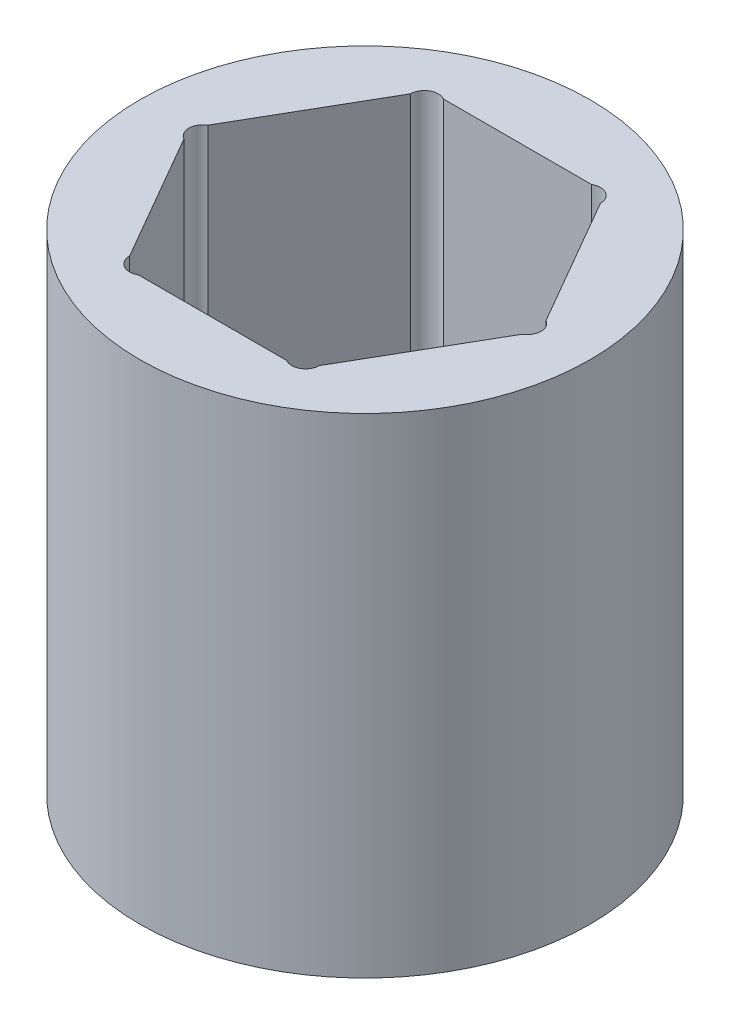
ISO-10303-21;
HEADER;
FILE_DESCRIPTION(('STEP AP214'),'2;1');
FILE_NAME('part.step','',(''),(''),'','','');
FILE_SCHEMA(('AUTOMOTIVE_DESIGN { 1 0 10303 214 1 1 1 1 }'));
ENDSEC;
DATA;
#1=APPLICATION_CONTEXT('core data for automotive mechanical design processes');
#2=APPLICATION_PROTOCOL_DEFINITION('international standard','automotive_design',2000,#1);
#3=PRODUCT_CONTEXT('',#1,'mechanical');
#4=PRODUCT('Part','Part','',(#3));
#5=PRODUCT_RELATED_PRODUCT_CATEGORY('part','',(#4));
#6=PRODUCT_DEFINITION_FORMATION('','',#4);
#7=PRODUCT_DEFINITION_CONTEXT('part definition',#1,'design');
#8=PRODUCT_DEFINITION('design','',#6,#7);
#9=PRODUCT_DEFINITION_SHAPE('','',#8);
#10=(LENGTH_UNIT() NAMED_UNIT(*) SI_UNIT(.MILLI.,.METRE.));
#11=(NAMED_UNIT(*) PLANE_ANGLE_UNIT() SI_UNIT($,.RADIAN.));
#12=(NAMED_UNIT(*) SI_UNIT($,.STERADIAN.) SOLID_ANGLE_UNIT());
#13=UNCERTAINTY_MEASURE_WITH_UNIT(LENGTH_MEASURE(1.E-05),#10,'distance_accuracy_value','');
#14=(GEOMETRIC_REPRESENTATION_CONTEXT(3) GLOBAL_UNCERTAINTY_ASSIGNED_CONTEXT((#13)) GLOBAL_UNIT_ASSIGNED_CONTEXT((#10,
#11,#12)) REPRESENTATION_CONTEXT('',''));
#15=CARTESIAN_POINT('',(0.,0.,0.));
#16=DIRECTION('',(0.,0.,1.));
#17=DIRECTION('',(1.,0.,0.));
#18=AXIS2_PLACEMENT_3D('',#15,#16,#17);
#19=CARTESIAN_POINT('',(-3.5128211777283,21.1836,-6.08438475772933));
#20=DIRECTION('',(0.,-1.,0.));
#21=DIRECTION('',(0.,0.,-1.));
#22=AXIS2_PLACEMENT_3D('',#19,#20,#21);
#23=CYLINDRICAL_SURFACE('',#22,0.600000000000001);
#24=CARTESIAN_POINT('',(-3.5128211777283,0.,-6.08438475772933));
#25=DIRECTION('',(0.,1.,0.));
#26=DIRECTION('',(0.,0.,1.));
#27=AXIS2_PLACEMENT_3D('',#24,#25,#26);
#28=CIRCLE('',#27,0.600000000000001);
#29=CARTESIAN_POINT('',(-3.2128211777283,0.,-6.604));
#30=VERTEX_POINT('',#29);
#31=CARTESIAN_POINT('',(-4.1128211777283,0.,-6.08438475772932));
#32=VERTEX_POINT('',#31);
#33=EDGE_CURVE('E157',#30,#32,#28,.T.);
#34=ORIENTED_EDGE('',*,*,#33,.F.);
#35=DIRECTION('',(0.,-1.,0.));
#36=VECTOR('',#35,1.);
#37=CARTESIAN_POINT('',(-3.2128211777283,21.1836,-6.604));
#38=LINE('',#37,#36);
#39=CARTESIAN_POINT('',(-3.2128211777283,21.1836,-6.604));
#40=VERTEX_POINT('',#39);
#41=EDGE_CURVE('E11',#40,#30,#38,.T.);
#42=ORIENTED_EDGE('',*,*,#41,.F.);
#43=CARTESIAN_POINT('',(-3.5128211777283,21.1836,-6.08438475772933));
#44=DIRECTION('',(0.,1.,0.));
#45=DIRECTION('',(0.,0.,1.));
#46=AXIS2_PLACEMENT_3D('',#43,#44,#45);
#47=CIRCLE('',#46,0.600000000000001);
#48=CARTESIAN_POINT('',(-4.1128211777283,21.1836,-6.08438475772932));
#49=VERTEX_POINT('',#48);
#50=EDGE_CURVE('E192',#40,#49,#47,.T.);
#51=ORIENTED_EDGE('',*,*,#50,.T.);
#52=DIRECTION('',(0.,-1.,0.));
#53=VECTOR('',#52,1.);
#54=CARTESIAN_POINT('',(-4.1128211777283,21.1836,-6.08438475772932));
#55=LINE('',#54,#53);
#56=EDGE_CURVE('E52',#49,#32,#55,.T.);
#57=ORIENTED_EDGE('',*,*,#56,.T.);
#58=EDGE_LOOP('',(#34,#42,#51,#57));
#59=FACE_BOUND('',#58,.T.);
#60=ADVANCED_FACE('F36',(#59),#23,.F.);
#61=CARTESIAN_POINT('',(0.,21.1836,-6.604));
#62=DIRECTION('',(0.,0.,1.));
#63=DIRECTION('',(1.,0.,0.));
#64=AXIS2_PLACEMENT_3D('',#61,#62,#63);
#65=PLANE('',#64);
#66=DIRECTION('',(-1.,0.,0.));
#67=VECTOR('',#66,1.);
#68=CARTESIAN_POINT('',(0.,0.,-6.604));
#69=LINE('',#68,#67);
#70=CARTESIAN_POINT('',(3.21282117772828,0.,-6.604));
#71=VERTEX_POINT('',#70);
#72=EDGE_CURVE('E159',#71,#30,#69,.T.);
#73=ORIENTED_EDGE('',*,*,#72,.F.);
#74=DIRECTION('',(0.,-1.,0.));
#75=VECTOR('',#74,1.);
#76=CARTESIAN_POINT('',(3.21282117772828,21.1836,-6.604));
#77=LINE('',#76,#75);
#78=CARTESIAN_POINT('',(3.21282117772828,21.1836,-6.604));
#79=VERTEX_POINT('',#78);
#80=EDGE_CURVE('E44',#79,#71,#77,.T.);
#81=ORIENTED_EDGE('',*,*,#80,.F.);
#82=DIRECTION('',(-1.,0.,0.));
#83=VECTOR('',#82,1.);
#84=CARTESIAN_POINT('',(0.,21.1836,-6.604));
#85=LINE('',#84,#83);
#86=EDGE_CURVE('E230',#79,#40,#85,.T.);
#87=ORIENTED_EDGE('',*,*,#86,.T.);
#88=ORIENTED_EDGE('',*,*,#41,.T.);
#89=EDGE_LOOP('',(#73,#81,#87,#88));
#90=FACE_BOUND('',#89,.T.);
#91=ADVANCED_FACE('F217',(#90),#65,.T.);
#92=CARTESIAN_POINT('',(3.51282117772829,21.1836,-6.08438475772934));
#93=DIRECTION('',(0.,-1.,0.));
#94=DIRECTION('',(0.,0.,-1.));
#95=AXIS2_PLACEMENT_3D('',#92,#93,#94);
#96=CYLINDRICAL_SURFACE('',#95,0.600000000000001);
#97=CARTESIAN_POINT('',(3.51282117772829,0.,-6.08438475772934));
#98=DIRECTION('',(0.,1.,0.));
#99=DIRECTION('',(0.,0.,1.));
#100=AXIS2_PLACEMENT_3D('',#97,#98,#99);
#101=CIRCLE('',#100,0.600000000000001);
#102=CARTESIAN_POINT('',(4.11282117772829,0.,-6.08438475772934));
#103=VERTEX_POINT('',#102);
#104=EDGE_CURVE('E162',#103,#71,#101,.T.);
#105=ORIENTED_EDGE('',*,*,#104,.F.);
#106=DIRECTION('',(0.,-1.,0.));
#107=VECTOR('',#106,1.);
#108=CARTESIAN_POINT('',(4.11282117772829,21.1836,-6.08438475772934));
#109=LINE('',#108,#107);
#110=CARTESIAN_POINT('',(4.11282117772829,21.1836,-6.08438475772934));
#111=VERTEX_POINT('',#110);
#112=EDGE_CURVE('E206',#111,#103,#109,.T.);
#113=ORIENTED_EDGE('',*,*,#112,.F.);
#114=CARTESIAN_POINT('',(3.51282117772829,21.1836,-6.08438475772934));
#115=DIRECTION('',(0.,1.,0.));
#116=DIRECTION('',(0.,0.,1.));
#117=AXIS2_PLACEMENT_3D('',#114,#115,#116);
#118=CIRCLE('',#117,0.600000000000001);
#119=EDGE_CURVE('E213',#111,#79,#118,.T.);
#120=ORIENTED_EDGE('',*,*,#119,.T.);
#121=ORIENTED_EDGE('',*,*,#80,.T.);
#122=EDGE_LOOP('',(#105,#113,#120,#121));
#123=FACE_BOUND('',#122,.T.);
#124=ADVANCED_FACE('F211',(#123),#96,.F.);
#125=CARTESIAN_POINT('',(5.71923176659243,21.1836,-3.302));
#126=DIRECTION('',(-0.866025403784438,0.,0.5));
#127=DIRECTION('',(0.5,0.,0.866025403784438));
#128=AXIS2_PLACEMENT_3D('',#125,#126,#127);
#129=PLANE('',#128);
#130=DIRECTION('',(-0.5,0.,-0.866025403784438));
#131=VECTOR('',#130,1.);
#132=CARTESIAN_POINT('',(5.71923176659243,0.,-3.302));
#133=LINE('',#132,#131);
#134=CARTESIAN_POINT('',(7.32564235545658,0.,-0.519615242270668));
#135=VERTEX_POINT('',#134);
#136=EDGE_CURVE('E165',#135,#103,#133,.T.);
#137=ORIENTED_EDGE('',*,*,#136,.F.);
#138=DIRECTION('',(0.,-1.,0.));
#139=VECTOR('',#138,1.);
#140=CARTESIAN_POINT('',(7.32564235545658,21.1836,-0.519615242270668));
#141=LINE('',#140,#139);
#142=CARTESIAN_POINT('',(7.32564235545658,21.1836,-0.519615242270668));
#143=VERTEX_POINT('',#142);
#144=EDGE_CURVE('E204',#143,#135,#141,.T.);
#145=ORIENTED_EDGE('',*,*,#144,.F.);
#146=DIRECTION('',(-0.5,0.,-0.866025403784438));
#147=VECTOR('',#146,1.);
#148=CARTESIAN_POINT('',(5.71923176659243,21.1836,-3.302));
#149=LINE('',#148,#147);
#150=EDGE_CURVE('E227',#143,#111,#149,.T.);
#151=ORIENTED_EDGE('',*,*,#150,.T.);
#152=ORIENTED_EDGE('',*,*,#112,.T.);
#153=EDGE_LOOP('',(#137,#145,#151,#152));
#154=FACE_BOUND('',#153,.T.);
#155=ADVANCED_FACE('F224',(#154),#129,.T.);
#156=CARTESIAN_POINT('',(7.02564235545658,21.1836,0.));
#157=DIRECTION('',(0.,-1.,0.));
#158=DIRECTION('',(0.,0.,-1.));
#159=AXIS2_PLACEMENT_3D('',#156,#157,#158);
#160=CYLINDRICAL_SURFACE('',#159,0.6);
#161=CARTESIAN_POINT('',(7.02564235545658,0.,0.));
#162=DIRECTION('',(0.,1.,0.));
#163=DIRECTION('',(0.,0.,1.));
#164=AXIS2_PLACEMENT_3D('',#161,#162,#163);
#165=CIRCLE('',#164,0.6);
#166=CARTESIAN_POINT('',(7.32564235545658,0.,0.519615242270659));
#167=VERTEX_POINT('',#166);
#168=EDGE_CURVE('E168',#167,#135,#165,.T.);
#169=ORIENTED_EDGE('',*,*,#168,.F.);
#170=DIRECTION('',(0.,-1.,0.));
#171=VECTOR('',#170,1.);
#172=CARTESIAN_POINT('',(7.32564235545658,21.1836,0.519615242270659));
#173=LINE('',#172,#171);
#174=CARTESIAN_POINT('',(7.32564235545658,21.1836,0.519615242270659));
#175=VERTEX_POINT('',#174);
#176=EDGE_CURVE('E202',#175,#167,#173,.T.);
#177=ORIENTED_EDGE('',*,*,#176,.F.);
#178=CARTESIAN_POINT('',(7.02564235545658,21.1836,0.));
#179=DIRECTION('',(0.,1.,0.));
#180=DIRECTION('',(0.,0.,1.));
#181=AXIS2_PLACEMENT_3D('',#178,#179,#180);
#182=CIRCLE('',#181,0.6);
#183=EDGE_CURVE('E232',#175,#143,#182,.T.);
#184=ORIENTED_EDGE('',*,*,#183,.T.);
#185=ORIENTED_EDGE('',*,*,#144,.T.);
#186=EDGE_LOOP('',(#169,#177,#184,#185));
#187=FACE_BOUND('',#186,.T.);
#188=ADVANCED_FACE('F272',(#187),#160,.F.);
#189=CARTESIAN_POINT('',(5.71923176659244,21.1836,3.302));
#190=DIRECTION('',(-0.866025403784439,0.,-0.499999999999999));
#191=DIRECTION('',(-0.499999999999999,0.,0.866025403784439));
#192=AXIS2_PLACEMENT_3D('',#189,#190,#191);
#193=PLANE('',#192);
#194=DIRECTION('',(0.499999999999999,0.,-0.866025403784439));
#195=VECTOR('',#194,1.);
#196=CARTESIAN_POINT('',(5.71923176659244,0.,3.302));
#197=LINE('',#196,#195);
#198=CARTESIAN_POINT('',(4.11282117772829,0.,6.08438475772933));
#199=VERTEX_POINT('',#198);
#200=EDGE_CURVE('E171',#199,#167,#197,.T.);
#201=ORIENTED_EDGE('',*,*,#200,.F.);
#202=DIRECTION('',(0.,-1.,0.));
#203=VECTOR('',#202,1.);
#204=CARTESIAN_POINT('',(4.11282117772829,21.1836,6.08438475772933));
#205=LINE('',#204,#203);
#206=CARTESIAN_POINT('',(4.11282117772829,21.1836,6.08438475772933));
#207=VERTEX_POINT('',#206);
#208=EDGE_CURVE('E200',#207,#199,#205,.T.);
#209=ORIENTED_EDGE('',*,*,#208,.F.);
#210=DIRECTION('',(0.499999999999999,0.,-0.866025403784439));
#211=VECTOR('',#210,1.);
#212=CARTESIAN_POINT('',(5.71923176659244,21.1836,3.302));
#213=LINE('',#212,#211);
#214=EDGE_CURVE('E238',#207,#175,#213,.T.);
#215=ORIENTED_EDGE('',*,*,#214,.T.);
#216=ORIENTED_EDGE('',*,*,#176,.T.);
#217=EDGE_LOOP('',(#201,#209,#215,#216));
#218=FACE_BOUND('',#217,.T.);
#219=ADVANCED_FACE('F275',(#218),#193,.T.);
#220=CARTESIAN_POINT('',(3.51282117772829,21.1836,6.08438475772933));
#221=DIRECTION('',(0.,-1.,0.));
#222=DIRECTION('',(0.,0.,-1.));
#223=AXIS2_PLACEMENT_3D('',#220,#221,#222);
#224=CYLINDRICAL_SURFACE('',#223,0.600000000000001);
#225=CARTESIAN_POINT('',(3.51282117772829,0.,6.08438475772933));
#226=DIRECTION('',(0.,1.,0.));
#227=DIRECTION('',(0.,0.,1.));
#228=AXIS2_PLACEMENT_3D('',#225,#226,#227);
#229=CIRCLE('',#228,0.600000000000001);
#230=CARTESIAN_POINT('',(3.21282117772829,0.,6.604));
#231=VERTEX_POINT('',#230);
#232=EDGE_CURVE('E174',#231,#199,#229,.T.);
#233=ORIENTED_EDGE('',*,*,#232,.F.);
#234=DIRECTION('',(0.,-1.,0.));
#235=VECTOR('',#234,1.);
#236=CARTESIAN_POINT('',(3.21282117772829,21.1836,6.604));
#237=LINE('',#236,#235);
#238=CARTESIAN_POINT('',(3.21282117772829,21.1836,6.604));
#239=VERTEX_POINT('',#238);
#240=EDGE_CURVE('E198',#239,#231,#237,.T.);
#241=ORIENTED_EDGE('',*,*,#240,.F.);
#242=CARTESIAN_POINT('',(3.51282117772829,21.1836,6.08438475772933));
#243=DIRECTION('',(0.,1.,0.));
#244=DIRECTION('',(0.,0.,1.));
#245=AXIS2_PLACEMENT_3D('',#242,#243,#244);
#246=CIRCLE('',#245,0.600000000000001);
#247=EDGE_CURVE('E241',#239,#207,#246,.T.);
#248=ORIENTED_EDGE('',*,*,#247,.T.);
#249=ORIENTED_EDGE('',*,*,#208,.T.);
#250=EDGE_LOOP('',(#233,#241,#248,#249));
#251=FACE_BOUND('',#250,.T.);
#252=ADVANCED_FACE('F279',(#251),#224,.F.);
#253=CARTESIAN_POINT('',(0.,21.1836,6.604));
#254=DIRECTION('',(0.,0.,-1.));
#255=DIRECTION('',(-1.,0.,0.));
#256=AXIS2_PLACEMENT_3D('',#253,#254,#255);
#257=PLANE('',#256);
#258=DIRECTION('',(1.,0.,0.));
#259=VECTOR('',#258,1.);
#260=CARTESIAN_POINT('',(0.,0.,6.604));
#261=LINE('',#260,#259);
#262=CARTESIAN_POINT('',(-3.21282117772829,0.,6.604));
#263=VERTEX_POINT('',#262);
#264=EDGE_CURVE('E177',#263,#231,#261,.T.);
#265=ORIENTED_EDGE('',*,*,#264,.F.);
#266=DIRECTION('',(0.,-1.,0.));
#267=VECTOR('',#266,1.);
#268=CARTESIAN_POINT('',(-3.21282117772829,21.1836,6.604));
#269=LINE('',#268,#267);
#270=CARTESIAN_POINT('',(-3.21282117772829,21.1836,6.604));
#271=VERTEX_POINT('',#270);
#272=EDGE_CURVE('E196',#271,#263,#269,.T.);
#273=ORIENTED_EDGE('',*,*,#272,.F.);
#274=DIRECTION('',(1.,0.,0.));
#275=VECTOR('',#274,1.);
#276=CARTESIAN_POINT('',(0.,21.1836,6.604));
#277=LINE('',#276,#275);
#278=EDGE_CURVE('E244',#271,#239,#277,.T.);
#279=ORIENTED_EDGE('',*,*,#278,.T.);
#280=ORIENTED_EDGE('',*,*,#240,.T.);
#281=EDGE_LOOP('',(#265,#273,#279,#280));
#282=FACE_BOUND('',#281,.T.);
#283=ADVANCED_FACE('F283',(#282),#257,.T.);
#284=CARTESIAN_POINT('',(-3.51282117772829,21.1836,6.08438475772934));
#285=DIRECTION('',(0.,-1.,0.));
#286=DIRECTION('',(0.,0.,-1.));
#287=AXIS2_PLACEMENT_3D('',#284,#285,#286);
#288=CYLINDRICAL_SURFACE('',#287,0.6);
#289=CARTESIAN_POINT('',(-3.51282117772829,0.,6.08438475772934));
#290=DIRECTION('',(0.,1.,0.));
#291=DIRECTION('',(0.,0.,1.));
#292=AXIS2_PLACEMENT_3D('',#289,#290,#291);
#293=CIRCLE('',#292,0.6);
#294=CARTESIAN_POINT('',(-4.11282117772828,0.,6.08438475772934));
#295=VERTEX_POINT('',#294);
#296=EDGE_CURVE('E180',#295,#263,#293,.T.);
#297=ORIENTED_EDGE('',*,*,#296,.F.);
#298=DIRECTION('',(0.,-1.,0.));
#299=VECTOR('',#298,1.);
#300=CARTESIAN_POINT('',(-4.11282117772828,21.1836,6.08438475772934));
#301=LINE('',#300,#299);
#302=CARTESIAN_POINT('',(-4.11282117772828,21.1836,6.08438475772934));
#303=VERTEX_POINT('',#302);
#304=EDGE_CURVE('E135',#303,#295,#301,.T.);
#305=ORIENTED_EDGE('',*,*,#304,.F.);
#306=CARTESIAN_POINT('',(-3.51282117772829,21.1836,6.08438475772934));
#307=DIRECTION('',(0.,1.,0.));
#308=DIRECTION('',(0.,0.,1.));
#309=AXIS2_PLACEMENT_3D('',#306,#307,#308);
#310=CIRCLE('',#309,0.6);
#311=EDGE_CURVE('E146',#303,#271,#310,.T.);
#312=ORIENTED_EDGE('',*,*,#311,.T.);
#313=ORIENTED_EDGE('',*,*,#272,.T.);
#314=EDGE_LOOP('',(#297,#305,#312,#313));
#315=FACE_BOUND('',#314,.T.);
#316=ADVANCED_FACE('F248',(#315),#288,.F.);
#317=CARTESIAN_POINT('',(-5.71923176659243,21.1836,3.302));
#318=DIRECTION('',(0.866025403784438,0.,-0.500000000000001));
#319=DIRECTION('',(-0.500000000000001,0.,-0.866025403784438));
#320=AXIS2_PLACEMENT_3D('',#317,#318,#319);
#321=PLANE('',#320);
#322=DIRECTION('',(0.500000000000001,0.,0.866025403784438));
#323=VECTOR('',#322,1.);
#324=CARTESIAN_POINT('',(-5.71923176659243,0.,3.302));
#325=LINE('',#324,#323);
#326=CARTESIAN_POINT('',(-7.32564235545657,0.,0.519615242270671));
#327=VERTEX_POINT('',#326);
#328=EDGE_CURVE('E131',#327,#295,#325,.T.);
#329=ORIENTED_EDGE('',*,*,#328,.F.);
#330=DIRECTION('',(0.,-1.,0.));
#331=VECTOR('',#330,1.);
#332=CARTESIAN_POINT('',(-7.32564235545657,21.1836,0.519615242270671));
#333=LINE('',#332,#331);
#334=CARTESIAN_POINT('',(-7.32564235545657,21.1836,0.519615242270671));
#335=VERTEX_POINT('',#334);
#336=EDGE_CURVE('E126',#335,#327,#333,.T.);
#337=ORIENTED_EDGE('',*,*,#336,.F.);
#338=DIRECTION('',(0.500000000000001,0.,0.866025403784438));
#339=VECTOR('',#338,1.);
#340=CARTESIAN_POINT('',(-5.71923176659243,21.1836,3.302));
#341=LINE('',#340,#339);
#342=EDGE_CURVE('E129',#335,#303,#341,.T.);
#343=ORIENTED_EDGE('',*,*,#342,.T.);
#344=ORIENTED_EDGE('',*,*,#304,.T.);
#345=EDGE_LOOP('',(#329,#337,#343,#344));
#346=FACE_BOUND('',#345,.T.);
#347=ADVANCED_FACE('F128',(#346),#321,.T.);
#348=CARTESIAN_POINT('',(-7.02564235545658,21.1836,0.));
#349=DIRECTION('',(0.,-1.,0.));
#350=DIRECTION('',(0.,0.,-1.));
#351=AXIS2_PLACEMENT_3D('',#348,#349,#350);
#352=CYLINDRICAL_SURFACE('',#351,0.6);
#353=CARTESIAN_POINT('',(-7.02564235545658,0.,0.));
#354=DIRECTION('',(0.,1.,0.));
#355=DIRECTION('',(0.,0.,1.));
#356=AXIS2_PLACEMENT_3D('',#353,#354,#355);
#357=CIRCLE('',#356,0.6);
#358=CARTESIAN_POINT('',(-7.32564235545658,0.,-0.519615242270657));
#359=VERTEX_POINT('',#358);
#360=EDGE_CURVE('E184',#359,#327,#357,.T.);
#361=ORIENTED_EDGE('',*,*,#360,.F.);
#362=DIRECTION('',(0.,-1.,0.));
#363=VECTOR('',#362,1.);
#364=CARTESIAN_POINT('',(-7.32564235545658,21.1836,-0.519615242270657));
#365=LINE('',#364,#363);
#366=CARTESIAN_POINT('',(-7.32564235545658,21.1836,-0.519615242270657));
#367=VERTEX_POINT('',#366);
#368=EDGE_CURVE('E89',#367,#359,#365,.T.);
#369=ORIENTED_EDGE('',*,*,#368,.F.);
#370=CARTESIAN_POINT('',(-7.02564235545658,21.1836,0.));
#371=DIRECTION('',(0.,1.,0.));
#372=DIRECTION('',(0.,0.,1.));
#373=AXIS2_PLACEMENT_3D('',#370,#371,#372);
#374=CIRCLE('',#373,0.6);
#375=EDGE_CURVE('E143',#367,#335,#374,.T.);
#376=ORIENTED_EDGE('',*,*,#375,.T.);
#377=ORIENTED_EDGE('',*,*,#336,.T.);
#378=EDGE_LOOP('',(#361,#369,#376,#377));
#379=FACE_BOUND('',#378,.T.);
#380=ADVANCED_FACE('F148',(#379),#352,.F.);
#381=CARTESIAN_POINT('',(-5.71923176659243,21.1836,-3.302));
#382=DIRECTION('',(0.866025403784439,0.,0.5));
#383=DIRECTION('',(0.5,0.,-0.866025403784439));
#384=AXIS2_PLACEMENT_3D('',#381,#382,#383);
#385=PLANE('',#384);
#386=DIRECTION('',(-0.5,0.,0.866025403784439));
#387=VECTOR('',#386,1.);
#388=CARTESIAN_POINT('',(-5.71923176659243,0.,-3.302));
#389=LINE('',#388,#387);
#390=EDGE_CURVE('E186',#32,#359,#389,.T.);
#391=ORIENTED_EDGE('',*,*,#390,.F.);
#392=ORIENTED_EDGE('',*,*,#56,.F.);
#393=DIRECTION('',(-0.5,0.,0.866025403784439));
#394=VECTOR('',#393,1.);
#395=CARTESIAN_POINT('',(-5.71923176659243,21.1836,-3.302));
#396=LINE('',#395,#394);
#397=EDGE_CURVE('E149',#49,#367,#396,.T.);
#398=ORIENTED_EDGE('',*,*,#397,.T.);
#399=ORIENTED_EDGE('',*,*,#368,.T.);
#400=EDGE_LOOP('',(#391,#392,#398,#399));
#401=FACE_BOUND('',#400,.T.);
#402=ADVANCED_FACE('F250',(#401),#385,.T.);
#403=CARTESIAN_POINT('',(0.,21.1836,0.));
#404=DIRECTION('',(0.,-1.,0.));
#405=DIRECTION('',(0.,0.,-1.));
#406=AXIS2_PLACEMENT_3D('',#403,#404,#405);
#407=CYLINDRICAL_SURFACE('',#406,9.7536);
#408=CARTESIAN_POINT('',(0.,21.1836,0.));
#409=DIRECTION('',(0.,1.,0.));
#410=DIRECTION('',(0.,0.,1.));
#411=AXIS2_PLACEMENT_3D('',#408,#409,#410);
#412=CIRCLE('',#411,9.7536);
#413=CARTESIAN_POINT('',(0.,21.1836,9.7536));
#414=VERTEX_POINT('',#413);
#415=EDGE_CURVE('E151',#414,#414,#412,.T.);
#416=ORIENTED_EDGE('',*,*,#415,.F.);
#417=EDGE_LOOP('',(#416));
#418=FACE_BOUND('',#417,.T.);
#419=CARTESIAN_POINT('',(0.,0.,0.));
#420=DIRECTION('',(0.,1.,0.));
#421=DIRECTION('',(0.,0.,1.));
#422=AXIS2_PLACEMENT_3D('',#419,#420,#421);
#423=CIRCLE('',#422,9.7536);
#424=CARTESIAN_POINT('',(0.,0.,9.7536));
#425=VERTEX_POINT('',#424);
#426=EDGE_CURVE('E189',#425,#425,#423,.T.);
#427=ORIENTED_EDGE('',*,*,#426,.T.);
#428=EDGE_LOOP('',(#427));
#429=FACE_BOUND('',#428,.T.);
#430=ADVANCED_FACE('F252',(#418,#429),#407,.T.);
#431=CARTESIAN_POINT('',(0.,21.1836,0.));
#432=DIRECTION('',(0.,1.,0.));
#433=DIRECTION('',(0.,0.,1.));
#434=AXIS2_PLACEMENT_3D('',#431,#432,#433);
#435=PLANE('',#434);
#436=ORIENTED_EDGE('',*,*,#50,.F.);
#437=ORIENTED_EDGE('',*,*,#86,.F.);
#438=ORIENTED_EDGE('',*,*,#119,.F.);
#439=ORIENTED_EDGE('',*,*,#150,.F.);
#440=ORIENTED_EDGE('',*,*,#183,.F.);
#441=ORIENTED_EDGE('',*,*,#214,.F.);
#442=ORIENTED_EDGE('',*,*,#247,.F.);
#443=ORIENTED_EDGE('',*,*,#278,.F.);
#444=ORIENTED_EDGE('',*,*,#311,.F.);
#445=ORIENTED_EDGE('',*,*,#342,.F.);
#446=ORIENTED_EDGE('',*,*,#375,.F.);
#447=ORIENTED_EDGE('',*,*,#397,.F.);
#448=EDGE_LOOP('',(#436,#437,#438,#439,#440,#441,#442,#443,#444,#445,#446,#447));
#449=FACE_BOUND('',#448,.T.);
#450=ORIENTED_EDGE('',*,*,#415,.T.);
#451=EDGE_LOOP('',(#450));
#452=FACE_BOUND('',#451,.T.);
#453=ADVANCED_FACE('F140',(#449,#452),#435,.T.);
#454=CARTESIAN_POINT('',(0.,0.,0.));
#455=DIRECTION('',(0.,1.,0.));
#456=DIRECTION('',(0.,0.,1.));
#457=AXIS2_PLACEMENT_3D('',#454,#455,#456);
#458=PLANE('',#457);
#459=ORIENTED_EDGE('',*,*,#33,.T.);
#460=ORIENTED_EDGE('',*,*,#390,.T.);
#461=ORIENTED_EDGE('',*,*,#360,.T.);
#462=ORIENTED_EDGE('',*,*,#328,.T.);
#463=ORIENTED_EDGE('',*,*,#296,.T.);
#464=ORIENTED_EDGE('',*,*,#264,.T.);
#465=ORIENTED_EDGE('',*,*,#232,.T.);
#466=ORIENTED_EDGE('',*,*,#200,.T.);
#467=ORIENTED_EDGE('',*,*,#168,.T.);
#468=ORIENTED_EDGE('',*,*,#136,.T.);
#469=ORIENTED_EDGE('',*,*,#104,.T.);
#470=ORIENTED_EDGE('',*,*,#72,.T.);
#471=EDGE_LOOP('',(#459,#460,#461,#462,#463,#464,#465,#466,#467,#468,#469,#470));
#472=FACE_BOUND('',#471,.T.);
#473=ORIENTED_EDGE('',*,*,#426,.F.);
#474=EDGE_LOOP('',(#473));
#475=FACE_BOUND('',#474,.T.);
#476=ADVANCED_FACE('F219',(#472,#475),#458,.F.);
#477=CLOSED_SHELL('',(#60,#91,#124,#155,#188,#219,#252,#283,#316,#347,#380,#402,#430,#453,#476));
#478=MANIFOLD_SOLID_BREP('B2',#477);
#479=ADVANCED_BREP_SHAPE_REPRESENTATION('',(#18,#478),#14);
#480=SHAPE_DEFINITION_REPRESENTATION(#9,#479);
ENDSEC;
END-ISO-10303-21;
